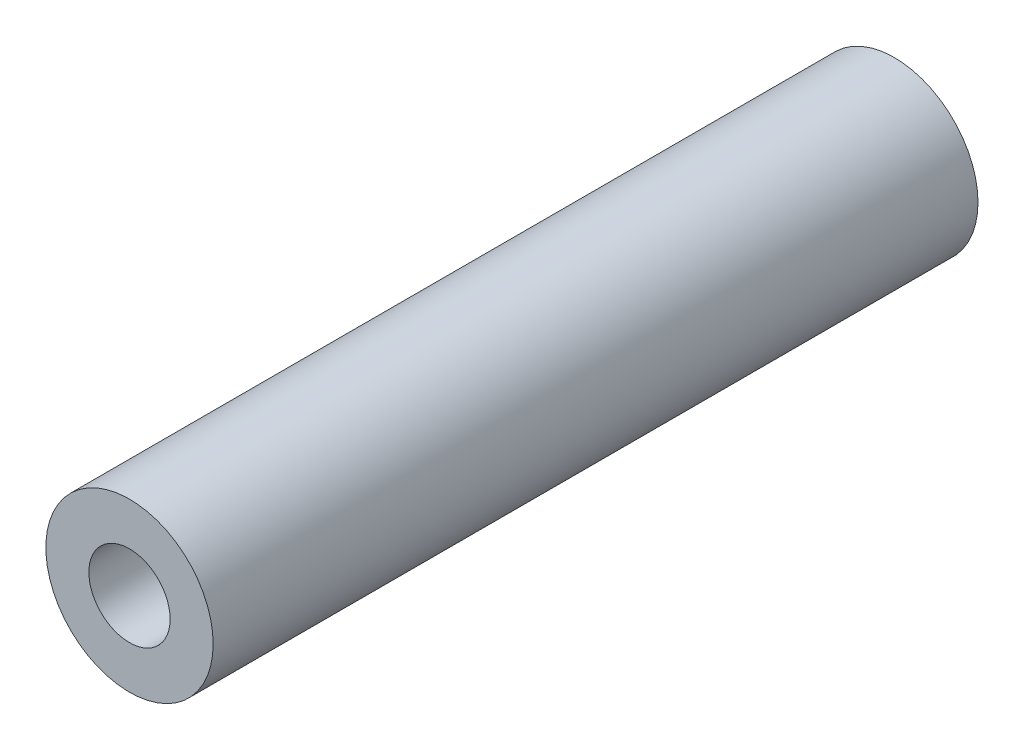
ISO-10303-21;
HEADER;
FILE_DESCRIPTION(('STEP AP214'),'2;1');
FILE_NAME('part.step','',(''),(''),'','','');
FILE_SCHEMA(('AUTOMOTIVE_DESIGN { 1 0 10303 214 1 1 1 1 }'));
ENDSEC;
DATA;
#1=APPLICATION_CONTEXT('core data for automotive mechanical design processes');
#2=APPLICATION_PROTOCOL_DEFINITION('international standard','automotive_design',2000,#1);
#3=PRODUCT_CONTEXT('',#1,'mechanical');
#4=PRODUCT('Part','Part','',(#3));
#5=PRODUCT_RELATED_PRODUCT_CATEGORY('part','',(#4));
#6=PRODUCT_DEFINITION_FORMATION('','',#4);
#7=PRODUCT_DEFINITION_CONTEXT('part definition',#1,'design');
#8=PRODUCT_DEFINITION('design','',#6,#7);
#9=PRODUCT_DEFINITION_SHAPE('','',#8);
#10=(LENGTH_UNIT() NAMED_UNIT(*) SI_UNIT(.MILLI.,.METRE.));
#11=(NAMED_UNIT(*) PLANE_ANGLE_UNIT() SI_UNIT($,.RADIAN.));
#12=(NAMED_UNIT(*) SI_UNIT($,.STERADIAN.) SOLID_ANGLE_UNIT());
#13=UNCERTAINTY_MEASURE_WITH_UNIT(LENGTH_MEASURE(1.E-05),#10,'distance_accuracy_value','');
#14=(GEOMETRIC_REPRESENTATION_CONTEXT(3) GLOBAL_UNCERTAINTY_ASSIGNED_CONTEXT((#13)) GLOBAL_UNIT_ASSIGNED_CONTEXT((#10,
#11,#12)) REPRESENTATION_CONTEXT('',''));
#15=CARTESIAN_POINT('',(0.,0.,0.));
#16=DIRECTION('',(0.,0.,1.));
#17=DIRECTION('',(1.,0.,0.));
#18=AXIS2_PLACEMENT_3D('',#15,#16,#17);
#19=CARTESIAN_POINT('',(112.,-170.,220.4));
#20=DIRECTION('',(0.,0.,1.));
#21=DIRECTION('',(1.,0.,0.));
#22=AXIS2_PLACEMENT_3D('',#19,#20,#21);
#23=CYLINDRICAL_SURFACE('',#22,1.7);
#24=DIRECTION('',(0.,0.,1.));
#25=VECTOR('',#24,1.);
#26=CARTESIAN_POINT('',(113.7,-170.,220.4));
#27=LINE('',#26,#25);
#28=CARTESIAN_POINT('',(113.7,-170.,220.5));
#29=VERTEX_POINT('',#28);
#30=CARTESIAN_POINT('',(113.7,-170.,252.5));
#31=VERTEX_POINT('',#30);
#32=EDGE_CURVE('E9',#29,#31,#27,.T.);
#33=ORIENTED_EDGE('',*,*,#32,.F.);
#34=CARTESIAN_POINT('',(112.,-170.,220.5));
#35=DIRECTION('',(0.,0.,1.));
#36=DIRECTION('',(1.,0.,0.));
#37=AXIS2_PLACEMENT_3D('',#34,#35,#36);
#38=CIRCLE('',#37,1.7);
#39=EDGE_CURVE('E17',#29,#29,#38,.T.);
#40=ORIENTED_EDGE('',*,*,#39,.F.);
#41=ORIENTED_EDGE('',*,*,#32,.T.);
#42=CARTESIAN_POINT('',(112.,-170.,252.5));
#43=DIRECTION('',(0.,0.,1.));
#44=DIRECTION('',(1.,0.,0.));
#45=AXIS2_PLACEMENT_3D('',#42,#43,#44);
#46=CIRCLE('',#45,1.7);
#47=EDGE_CURVE('E64',#31,#31,#46,.T.);
#48=ORIENTED_EDGE('',*,*,#47,.T.);
#49=EDGE_LOOP('',(#33,#40,#41,#48));
#50=FACE_BOUND('',#49,.T.);
#51=ADVANCED_FACE('F14',(#50),#23,.F.);
#52=CARTESIAN_POINT('',(112.,-170.,220.5));
#53=DIRECTION('',(0.,0.,1.));
#54=DIRECTION('',(1.,0.,0.));
#55=AXIS2_PLACEMENT_3D('',#52,#53,#54);
#56=PLANE('',#55);
#57=ORIENTED_EDGE('',*,*,#39,.T.);
#58=EDGE_LOOP('',(#57));
#59=FACE_BOUND('',#58,.T.);
#60=CARTESIAN_POINT('',(112.,-170.,220.5));
#61=DIRECTION('',(0.,0.,1.));
#62=DIRECTION('',(1.,0.,0.));
#63=AXIS2_PLACEMENT_3D('',#60,#61,#62);
#64=CIRCLE('',#63,3.5);
#65=CARTESIAN_POINT('',(115.5,-170.,220.5));
#66=VERTEX_POINT('',#65);
#67=EDGE_CURVE('E47',#66,#66,#64,.T.);
#68=ORIENTED_EDGE('',*,*,#67,.F.);
#69=EDGE_LOOP('',(#68));
#70=FACE_BOUND('',#69,.T.);
#71=ADVANCED_FACE('F73',(#59,#70),#56,.F.);
#72=CARTESIAN_POINT('',(112.,-170.,252.5));
#73=DIRECTION('',(0.,0.,1.));
#74=DIRECTION('',(1.,0.,0.));
#75=AXIS2_PLACEMENT_3D('',#72,#73,#74);
#76=PLANE('',#75);
#77=ORIENTED_EDGE('',*,*,#47,.F.);
#78=EDGE_LOOP('',(#77));
#79=FACE_BOUND('',#78,.T.);
#80=CARTESIAN_POINT('',(112.,-170.,252.5));
#81=DIRECTION('',(0.,0.,1.));
#82=DIRECTION('',(1.,0.,0.));
#83=AXIS2_PLACEMENT_3D('',#80,#81,#82);
#84=CIRCLE('',#83,3.5);
#85=CARTESIAN_POINT('',(115.5,-170.,252.5));
#86=VERTEX_POINT('',#85);
#87=EDGE_CURVE('E54',#86,#86,#84,.T.);
#88=ORIENTED_EDGE('',*,*,#87,.T.);
#89=EDGE_LOOP('',(#88));
#90=FACE_BOUND('',#89,.T.);
#91=ADVANCED_FACE('F58',(#79,#90),#76,.T.);
#92=CARTESIAN_POINT('',(112.,-170.,220.5));
#93=DIRECTION('',(0.,0.,1.));
#94=DIRECTION('',(1.,0.,0.));
#95=AXIS2_PLACEMENT_3D('',#92,#93,#94);
#96=CYLINDRICAL_SURFACE('',#95,3.5);
#97=ORIENTED_EDGE('',*,*,#87,.F.);
#98=DIRECTION('',(0.,0.,1.));
#99=VECTOR('',#98,1.);
#100=CARTESIAN_POINT('',(115.5,-170.,220.5));
#101=LINE('',#100,#99);
#102=EDGE_CURVE('E51',#66,#86,#101,.T.);
#103=ORIENTED_EDGE('',*,*,#102,.F.);
#104=ORIENTED_EDGE('',*,*,#67,.T.);
#105=ORIENTED_EDGE('',*,*,#102,.T.);
#106=EDGE_LOOP('',(#97,#103,#104,#105));
#107=FACE_BOUND('',#106,.T.);
#108=ADVANCED_FACE('F53',(#107),#96,.T.);
#109=CLOSED_SHELL('',(#51,#71,#91,#108));
#110=MANIFOLD_SOLID_BREP('B1',#109);
#111=ADVANCED_BREP_SHAPE_REPRESENTATION('',(#18,#110),#14);
#112=SHAPE_DEFINITION_REPRESENTATION(#9,#111);
ENDSEC;
END-ISO-10303-21;
